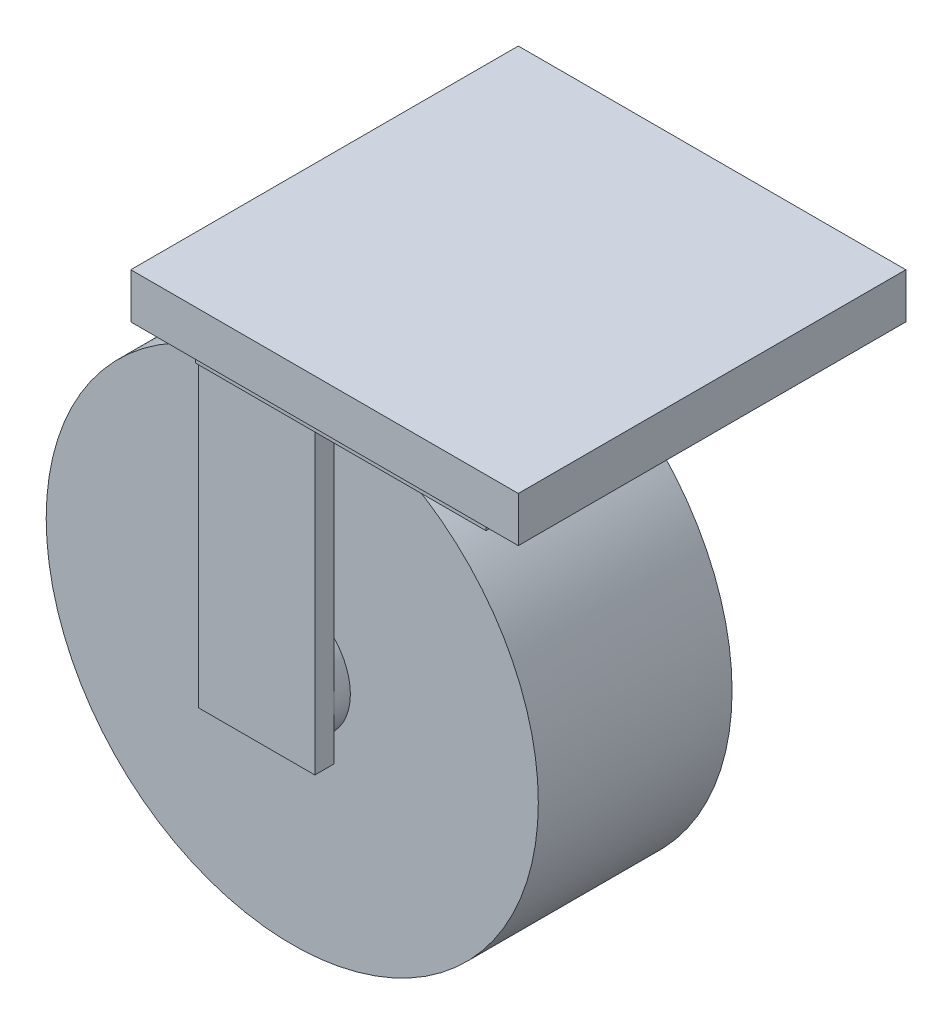
ISO-10303-21;
HEADER;
FILE_DESCRIPTION(('STEP AP214'),'2;1');
FILE_NAME('part.step','',(''),(''),'','','');
FILE_SCHEMA(('AUTOMOTIVE_DESIGN { 1 0 10303 214 1 1 1 1 }'));
ENDSEC;
DATA;
#1=APPLICATION_CONTEXT('core data for automotive mechanical design processes');
#2=APPLICATION_PROTOCOL_DEFINITION('international standard','automotive_design',2000,#1);
#3=PRODUCT_CONTEXT('',#1,'mechanical');
#4=PRODUCT('Part','Part','',(#3));
#5=PRODUCT_RELATED_PRODUCT_CATEGORY('part','',(#4));
#6=PRODUCT_DEFINITION_FORMATION('','',#4);
#7=PRODUCT_DEFINITION_CONTEXT('part definition',#1,'design');
#8=PRODUCT_DEFINITION('design','',#6,#7);
#9=PRODUCT_DEFINITION_SHAPE('','',#8);
#10=(LENGTH_UNIT() NAMED_UNIT(*) SI_UNIT(.MILLI.,.METRE.));
#11=(NAMED_UNIT(*) PLANE_ANGLE_UNIT() SI_UNIT($,.RADIAN.));
#12=(NAMED_UNIT(*) SI_UNIT($,.STERADIAN.) SOLID_ANGLE_UNIT());
#13=UNCERTAINTY_MEASURE_WITH_UNIT(LENGTH_MEASURE(1.E-05),#10,'distance_accuracy_value','');
#14=(GEOMETRIC_REPRESENTATION_CONTEXT(3) GLOBAL_UNCERTAINTY_ASSIGNED_CONTEXT((#13)) GLOBAL_UNIT_ASSIGNED_CONTEXT((#10,
#11,#12)) REPRESENTATION_CONTEXT('',''));
#15=CARTESIAN_POINT('',(0.,0.,0.));
#16=DIRECTION('',(0.,0.,1.));
#17=DIRECTION('',(1.,0.,0.));
#18=AXIS2_PLACEMENT_3D('',#15,#16,#17);
#19=CARTESIAN_POINT('',(-5.95,38.1,17.5));
#20=DIRECTION('',(0.,0.,-1.));
#21=DIRECTION('',(-1.,0.,0.));
#22=AXIS2_PLACEMENT_3D('',#19,#20,#21);
#23=CYLINDRICAL_SURFACE('',#22,9.);
#24=CARTESIAN_POINT('',(-5.95,38.1,-17.5));
#25=DIRECTION('',(0.,0.,1.));
#26=DIRECTION('',(1.,0.,0.));
#27=AXIS2_PLACEMENT_3D('',#24,#25,#26);
#28=CIRCLE('',#27,9.);
#29=CARTESIAN_POINT('',(3.05,38.1,-17.5));
#30=VERTEX_POINT('',#29);
#31=CARTESIAN_POINT('',(-14.95,38.1,-17.5));
#32=VERTEX_POINT('',#31);
#33=EDGE_CURVE('E384',#30,#32,#28,.T.);
#34=ORIENTED_EDGE('',*,*,#33,.T.);
#35=CARTESIAN_POINT('',(-9.8730090491866,30.,-17.5));
#36=VERTEX_POINT('',#35);
#37=EDGE_CURVE('E56',#32,#36,#28,.T.);
#38=ORIENTED_EDGE('',*,*,#37,.T.);
#39=CARTESIAN_POINT('',(-2.0269909508134,30.,-17.5));
#40=VERTEX_POINT('',#39);
#41=EDGE_CURVE('E400',#36,#40,#28,.T.);
#42=ORIENTED_EDGE('',*,*,#41,.T.);
#43=EDGE_CURVE('E69',#40,#30,#28,.T.);
#44=ORIENTED_EDGE('',*,*,#43,.T.);
#45=EDGE_LOOP('',(#34,#38,#42,#44));
#46=FACE_BOUND('',#45,.T.);
#47=CARTESIAN_POINT('',(-5.95,38.1,-15.));
#48=DIRECTION('',(0.,0.,1.));
#49=DIRECTION('',(1.,0.,0.));
#50=AXIS2_PLACEMENT_3D('',#47,#48,#49);
#51=CIRCLE('',#50,9.);
#52=CARTESIAN_POINT('',(3.05,38.1,-15.));
#53=VERTEX_POINT('',#52);
#54=EDGE_CURVE('E11',#53,#53,#51,.T.);
#55=ORIENTED_EDGE('',*,*,#54,.F.);
#56=EDGE_LOOP('',(#55));
#57=FACE_BOUND('',#56,.T.);
#58=ADVANCED_FACE('F43',(#46,#57),#23,.T.);
#59=CARTESIAN_POINT('',(-14.95,78.,-17.5));
#60=DIRECTION('',(0.,0.,-1.));
#61=DIRECTION('',(-1.,0.,0.));
#62=AXIS2_PLACEMENT_3D('',#59,#60,#61);
#63=PLANE('',#62);
#64=ORIENTED_EDGE('',*,*,#37,.F.);
#65=DIRECTION('',(0.,-1.,0.));
#66=VECTOR('',#65,1.);
#67=CARTESIAN_POINT('',(-14.95,78.,-17.5));
#68=LINE('',#67,#66);
#69=CARTESIAN_POINT('',(-14.95,30.,-17.5));
#70=VERTEX_POINT('',#69);
#71=EDGE_CURVE('E271',#32,#70,#68,.T.);
#72=ORIENTED_EDGE('',*,*,#71,.T.);
#73=DIRECTION('',(1.,0.,0.));
#74=VECTOR('',#73,1.);
#75=CARTESIAN_POINT('',(-14.95,30.,-17.5));
#76=LINE('',#75,#74);
#77=EDGE_CURVE('E254',#70,#36,#76,.T.);
#78=ORIENTED_EDGE('',*,*,#77,.T.);
#79=EDGE_LOOP('',(#64,#72,#78));
#80=FACE_BOUND('',#79,.T.);
#81=ADVANCED_FACE('F410',(#80),#63,.F.);
#82=ORIENTED_EDGE('',*,*,#33,.F.);
#83=DIRECTION('',(0.,-1.,0.));
#84=VECTOR('',#83,1.);
#85=CARTESIAN_POINT('',(3.05,78.,-17.5));
#86=LINE('',#85,#84);
#87=CARTESIAN_POINT('',(3.05,76.5,-17.5));
#88=VERTEX_POINT('',#87);
#89=EDGE_CURVE('E267',#88,#30,#86,.T.);
#90=ORIENTED_EDGE('',*,*,#89,.F.);
#91=DIRECTION('',(-1.,0.,0.));
#92=VECTOR('',#91,1.);
#93=CARTESIAN_POINT('',(0.,76.5,-17.5));
#94=LINE('',#93,#92);
#95=CARTESIAN_POINT('',(-14.95,76.5,-17.5));
#96=VERTEX_POINT('',#95);
#97=EDGE_CURVE('E360',#88,#96,#94,.T.);
#98=ORIENTED_EDGE('',*,*,#97,.T.);
#99=EDGE_CURVE('E275',#96,#32,#68,.T.);
#100=ORIENTED_EDGE('',*,*,#99,.T.);
#101=EDGE_LOOP('',(#82,#90,#98,#100));
#102=FACE_BOUND('',#101,.T.);
#103=ADVANCED_FACE('F408',(#102),#63,.F.);
#104=CARTESIAN_POINT('',(3.05,78.,17.5));
#105=DIRECTION('',(0.,0.,1.));
#106=DIRECTION('',(1.,0.,0.));
#107=AXIS2_PLACEMENT_3D('',#104,#105,#106);
#108=PLANE('',#107);
#109=DIRECTION('',(0.,-1.,0.));
#110=VECTOR('',#109,1.);
#111=CARTESIAN_POINT('',(-14.95,78.,17.5));
#112=LINE('',#111,#110);
#113=CARTESIAN_POINT('',(-14.95,38.1,17.5));
#114=VERTEX_POINT('',#113);
#115=CARTESIAN_POINT('',(-14.95,30.,17.5));
#116=VERTEX_POINT('',#115);
#117=EDGE_CURVE('E223',#114,#116,#112,.T.);
#118=ORIENTED_EDGE('',*,*,#117,.F.);
#119=CARTESIAN_POINT('',(-5.95,38.1,17.5));
#120=DIRECTION('',(0.,0.,1.));
#121=DIRECTION('',(1.,0.,0.));
#122=AXIS2_PLACEMENT_3D('',#119,#120,#121);
#123=CIRCLE('',#122,9.);
#124=CARTESIAN_POINT('',(-9.8730090491866,30.,17.5));
#125=VERTEX_POINT('',#124);
#126=EDGE_CURVE('E205',#114,#125,#123,.T.);
#127=ORIENTED_EDGE('',*,*,#126,.T.);
#128=DIRECTION('',(-1.,0.,0.));
#129=VECTOR('',#128,1.);
#130=CARTESIAN_POINT('',(3.05,30.,17.5));
#131=LINE('',#130,#129);
#132=EDGE_CURVE('E229',#125,#116,#131,.T.);
#133=ORIENTED_EDGE('',*,*,#132,.T.);
#134=EDGE_LOOP('',(#118,#127,#133));
#135=FACE_BOUND('',#134,.T.);
#136=ADVANCED_FACE('F228',(#135),#108,.F.);
#137=DIRECTION('',(0.,-1.,0.));
#138=VECTOR('',#137,1.);
#139=CARTESIAN_POINT('',(3.05,78.,17.5));
#140=LINE('',#139,#138);
#141=CARTESIAN_POINT('',(3.05,76.5,17.5));
#142=VERTEX_POINT('',#141);
#143=CARTESIAN_POINT('',(3.05,38.1,17.5));
#144=VERTEX_POINT('',#143);
#145=EDGE_CURVE('E225',#142,#144,#140,.T.);
#146=ORIENTED_EDGE('',*,*,#145,.T.);
#147=EDGE_CURVE('E202',#144,#114,#123,.T.);
#148=ORIENTED_EDGE('',*,*,#147,.T.);
#149=CARTESIAN_POINT('',(-14.95,76.5,17.5));
#150=VERTEX_POINT('',#149);
#151=EDGE_CURVE('E219',#150,#114,#112,.T.);
#152=ORIENTED_EDGE('',*,*,#151,.F.);
#153=DIRECTION('',(1.,0.,0.));
#154=VECTOR('',#153,1.);
#155=CARTESIAN_POINT('',(0.,76.5,17.5));
#156=LINE('',#155,#154);
#157=EDGE_CURVE('E247',#150,#142,#156,.T.);
#158=ORIENTED_EDGE('',*,*,#157,.T.);
#159=EDGE_LOOP('',(#146,#148,#152,#158));
#160=FACE_BOUND('',#159,.T.);
#161=ADVANCED_FACE('F220',(#160),#108,.F.);
#162=CARTESIAN_POINT('',(3.05,30.,17.5));
#163=VERTEX_POINT('',#162);
#164=CARTESIAN_POINT('',(-2.0269909508134,30.,17.5));
#165=VERTEX_POINT('',#164);
#166=EDGE_CURVE('E232',#163,#165,#131,.T.);
#167=ORIENTED_EDGE('',*,*,#166,.T.);
#168=EDGE_CURVE('E221',#165,#144,#123,.T.);
#169=ORIENTED_EDGE('',*,*,#168,.T.);
#170=EDGE_CURVE('E240',#144,#163,#140,.T.);
#171=ORIENTED_EDGE('',*,*,#170,.T.);
#172=EDGE_LOOP('',(#167,#169,#171));
#173=FACE_BOUND('',#172,.T.);
#174=ADVANCED_FACE('F449',(#173),#108,.F.);
#175=CARTESIAN_POINT('',(0.,76.5,0.));
#176=DIRECTION('',(0.,1.,0.));
#177=DIRECTION('',(0.,0.,1.));
#178=AXIS2_PLACEMENT_3D('',#175,#176,#177);
#179=PLANE('',#178);
#180=DIRECTION('',(-1.,0.,0.));
#181=VECTOR('',#180,1.);
#182=CARTESIAN_POINT('',(0.,76.5,20.5));
#183=LINE('',#182,#181);
#184=CARTESIAN_POINT('',(3.05,76.5,20.5));
#185=VERTEX_POINT('',#184);
#186=CARTESIAN_POINT('',(-14.95,76.5,20.5));
#187=VERTEX_POINT('',#186);
#188=EDGE_CURVE('E250',#185,#187,#183,.T.);
#189=ORIENTED_EDGE('',*,*,#188,.F.);
#190=DIRECTION('',(0.,0.,1.));
#191=VECTOR('',#190,1.);
#192=CARTESIAN_POINT('',(3.05,76.5,0.));
#193=LINE('',#192,#191);
#194=EDGE_CURVE('E55',#142,#185,#193,.T.);
#195=ORIENTED_EDGE('',*,*,#194,.F.);
#196=ORIENTED_EDGE('',*,*,#157,.F.);
#197=DIRECTION('',(0.,0.,1.));
#198=VECTOR('',#197,1.);
#199=CARTESIAN_POINT('',(-14.95,76.5,-21.));
#200=LINE('',#199,#198);
#201=EDGE_CURVE('E237',#96,#150,#200,.T.);
#202=ORIENTED_EDGE('',*,*,#201,.F.);
#203=ORIENTED_EDGE('',*,*,#97,.F.);
#204=DIRECTION('',(0.,0.,1.));
#205=VECTOR('',#204,1.);
#206=CARTESIAN_POINT('',(3.05,76.5,0.));
#207=LINE('',#206,#205);
#208=CARTESIAN_POINT('',(3.05,76.5,-20.5));
#209=VERTEX_POINT('',#208);
#210=EDGE_CURVE('E351',#209,#88,#207,.T.);
#211=ORIENTED_EDGE('',*,*,#210,.F.);
#212=DIRECTION('',(1.,0.,0.));
#213=VECTOR('',#212,1.);
#214=CARTESIAN_POINT('',(0.,76.5,-20.5));
#215=LINE('',#214,#213);
#216=CARTESIAN_POINT('',(-14.95,76.5,-20.5));
#217=VERTEX_POINT('',#216);
#218=EDGE_CURVE('E354',#217,#209,#215,.T.);
#219=ORIENTED_EDGE('',*,*,#218,.F.);
#220=CARTESIAN_POINT('',(-14.95,76.5,-21.));
#221=VERTEX_POINT('',#220);
#222=EDGE_CURVE('E298',#221,#217,#200,.T.);
#223=ORIENTED_EDGE('',*,*,#222,.F.);
#224=DIRECTION('',(-1.,0.,0.));
#225=VECTOR('',#224,1.);
#226=CARTESIAN_POINT('',(30.05,76.5,-21.));
#227=LINE('',#226,#225);
#228=CARTESIAN_POINT('',(30.05,76.5,-21.));
#229=VERTEX_POINT('',#228);
#230=EDGE_CURVE('E278',#229,#221,#227,.T.);
#231=ORIENTED_EDGE('',*,*,#230,.F.);
#232=DIRECTION('',(0.,0.,-1.));
#233=VECTOR('',#232,1.);
#234=CARTESIAN_POINT('',(30.05,76.5,21.));
#235=LINE('',#234,#233);
#236=CARTESIAN_POINT('',(30.05,76.5,21.));
#237=VERTEX_POINT('',#236);
#238=EDGE_CURVE('E302',#237,#229,#235,.T.);
#239=ORIENTED_EDGE('',*,*,#238,.F.);
#240=DIRECTION('',(1.,0.,0.));
#241=VECTOR('',#240,1.);
#242=CARTESIAN_POINT('',(-14.95,76.5,21.));
#243=LINE('',#242,#241);
#244=CARTESIAN_POINT('',(-14.95,76.5,21.));
#245=VERTEX_POINT('',#244);
#246=EDGE_CURVE('E300',#245,#237,#243,.T.);
#247=ORIENTED_EDGE('',*,*,#246,.F.);
#248=EDGE_CURVE('E274',#187,#245,#200,.T.);
#249=ORIENTED_EDGE('',*,*,#248,.F.);
#250=EDGE_LOOP('',(#189,#195,#196,#202,#203,#211,#219,#223,#231,#239,#247,#249));
#251=FACE_BOUND('',#250,.T.);
#252=ADVANCED_FACE('F419',(#251),#179,.F.);
#253=CARTESIAN_POINT('',(14.05,80.,0.));
#254=DIRECTION('',(0.,1.,0.));
#255=DIRECTION('',(0.,0.,1.));
#256=AXIS2_PLACEMENT_3D('',#253,#254,#255);
#257=PLANE('',#256);
#258=CARTESIAN_POINT('',(14.05,80.,0.));
#259=DIRECTION('',(0.,1.,0.));
#260=DIRECTION('',(0.,0.,1.));
#261=AXIS2_PLACEMENT_3D('',#258,#259,#260);
#262=CIRCLE('',#261,22.);
#263=CARTESIAN_POINT('',(7.49256147569799,80.,21.));
#264=VERTEX_POINT('',#263);
#265=CARTESIAN_POINT('',(20.607438524302,80.,21.));
#266=VERTEX_POINT('',#265);
#267=EDGE_CURVE('E312',#264,#266,#262,.T.);
#268=ORIENTED_EDGE('',*,*,#267,.F.);
#269=DIRECTION('',(1.,0.,0.));
#270=VECTOR('',#269,1.);
#271=CARTESIAN_POINT('',(-14.95,80.,21.));
#272=LINE('',#271,#270);
#273=EDGE_CURVE('E281',#264,#266,#272,.T.);
#274=ORIENTED_EDGE('',*,*,#273,.T.);
#275=EDGE_LOOP('',(#268,#274));
#276=FACE_BOUND('',#275,.T.);
#277=ADVANCED_FACE('F495',(#276),#257,.F.);
#278=CARTESIAN_POINT('',(30.05,80.,15.0996688705415));
#279=VERTEX_POINT('',#278);
#280=CARTESIAN_POINT('',(30.05,80.,-15.0996688705415));
#281=VERTEX_POINT('',#280);
#282=EDGE_CURVE('E323',#279,#281,#262,.T.);
#283=ORIENTED_EDGE('',*,*,#282,.F.);
#284=DIRECTION('',(0.,0.,-1.));
#285=VECTOR('',#284,1.);
#286=CARTESIAN_POINT('',(30.05,80.,21.));
#287=LINE('',#286,#285);
#288=EDGE_CURVE('E288',#279,#281,#287,.T.);
#289=ORIENTED_EDGE('',*,*,#288,.T.);
#290=EDGE_LOOP('',(#283,#289));
#291=FACE_BOUND('',#290,.T.);
#292=ADVANCED_FACE('F501',(#291),#257,.F.);
#293=CARTESIAN_POINT('',(-15.95,93.,-30.));
#294=DIRECTION('',(1.,0.,0.));
#295=DIRECTION('',(0.,0.,-1.));
#296=AXIS2_PLACEMENT_3D('',#293,#294,#295);
#297=PLANE('',#296);
#298=DIRECTION('',(0.,-1.,0.));
#299=VECTOR('',#298,1.);
#300=CARTESIAN_POINT('',(-15.95,93.,-30.));
#301=LINE('',#300,#299);
#302=CARTESIAN_POINT('',(-15.95,93.,-30.));
#303=VERTEX_POINT('',#302);
#304=CARTESIAN_POINT('',(-15.95,86.,-30.));
#305=VERTEX_POINT('',#304);
#306=EDGE_CURVE('E341',#303,#305,#301,.T.);
#307=ORIENTED_EDGE('',*,*,#306,.T.);
#308=DIRECTION('',(0.,0.,1.));
#309=VECTOR('',#308,1.);
#310=CARTESIAN_POINT('',(-15.95,86.,-30.));
#311=LINE('',#310,#309);
#312=CARTESIAN_POINT('',(-15.95,86.,30.));
#313=VERTEX_POINT('',#312);
#314=EDGE_CURVE('E317',#305,#313,#311,.T.);
#315=ORIENTED_EDGE('',*,*,#314,.T.);
#316=DIRECTION('',(0.,-1.,0.));
#317=VECTOR('',#316,1.);
#318=CARTESIAN_POINT('',(-15.95,93.,30.));
#319=LINE('',#318,#317);
#320=CARTESIAN_POINT('',(-15.95,93.,30.));
#321=VERTEX_POINT('',#320);
#322=EDGE_CURVE('E348',#321,#313,#319,.T.);
#323=ORIENTED_EDGE('',*,*,#322,.F.);
#324=DIRECTION('',(0.,0.,1.));
#325=VECTOR('',#324,1.);
#326=CARTESIAN_POINT('',(-15.95,93.,-30.));
#327=LINE('',#326,#325);
#328=EDGE_CURVE('E333',#303,#321,#327,.T.);
#329=ORIENTED_EDGE('',*,*,#328,.F.);
#330=EDGE_LOOP('',(#307,#315,#323,#329));
#331=FACE_BOUND('',#330,.T.);
#332=ADVANCED_FACE('F44',(#331),#297,.F.);
#333=CARTESIAN_POINT('',(-15.95,93.,30.));
#334=DIRECTION('',(0.,0.,-1.));
#335=DIRECTION('',(-1.,0.,0.));
#336=AXIS2_PLACEMENT_3D('',#333,#334,#335);
#337=PLANE('',#336);
#338=ORIENTED_EDGE('',*,*,#322,.T.);
#339=DIRECTION('',(1.,0.,0.));
#340=VECTOR('',#339,1.);
#341=CARTESIAN_POINT('',(-15.95,86.,30.));
#342=LINE('',#341,#340);
#343=CARTESIAN_POINT('',(44.05,86.,30.));
#344=VERTEX_POINT('',#343);
#345=EDGE_CURVE('E326',#313,#344,#342,.T.);
#346=ORIENTED_EDGE('',*,*,#345,.T.);
#347=DIRECTION('',(0.,-1.,0.));
#348=VECTOR('',#347,1.);
#349=CARTESIAN_POINT('',(44.05,93.,30.));
#350=LINE('',#349,#348);
#351=CARTESIAN_POINT('',(44.05,93.,30.));
#352=VERTEX_POINT('',#351);
#353=EDGE_CURVE('E346',#352,#344,#350,.T.);
#354=ORIENTED_EDGE('',*,*,#353,.F.);
#355=DIRECTION('',(1.,0.,0.));
#356=VECTOR('',#355,1.);
#357=CARTESIAN_POINT('',(-15.95,93.,30.));
#358=LINE('',#357,#356);
#359=EDGE_CURVE('E337',#321,#352,#358,.T.);
#360=ORIENTED_EDGE('',*,*,#359,.F.);
#361=EDGE_LOOP('',(#338,#346,#354,#360));
#362=FACE_BOUND('',#361,.T.);
#363=ADVANCED_FACE('F525',(#362),#337,.F.);
#364=CARTESIAN_POINT('',(44.05,93.,30.));
#365=DIRECTION('',(-1.,0.,0.));
#366=DIRECTION('',(0.,0.,1.));
#367=AXIS2_PLACEMENT_3D('',#364,#365,#366);
#368=PLANE('',#367);
#369=ORIENTED_EDGE('',*,*,#353,.T.);
#370=DIRECTION('',(0.,0.,-1.));
#371=VECTOR('',#370,1.);
#372=CARTESIAN_POINT('',(44.05,86.,30.));
#373=LINE('',#372,#371);
#374=CARTESIAN_POINT('',(44.05,86.,-30.));
#375=VERTEX_POINT('',#374);
#376=EDGE_CURVE('E328',#344,#375,#373,.T.);
#377=ORIENTED_EDGE('',*,*,#376,.T.);
#378=DIRECTION('',(0.,-1.,0.));
#379=VECTOR('',#378,1.);
#380=CARTESIAN_POINT('',(44.05,93.,-30.));
#381=LINE('',#380,#379);
#382=CARTESIAN_POINT('',(44.05,93.,-30.));
#383=VERTEX_POINT('',#382);
#384=EDGE_CURVE('E347',#383,#375,#381,.T.);
#385=ORIENTED_EDGE('',*,*,#384,.F.);
#386=DIRECTION('',(0.,0.,-1.));
#387=VECTOR('',#386,1.);
#388=CARTESIAN_POINT('',(44.05,93.,30.));
#389=LINE('',#388,#387);
#390=EDGE_CURVE('E336',#352,#383,#389,.T.);
#391=ORIENTED_EDGE('',*,*,#390,.F.);
#392=EDGE_LOOP('',(#369,#377,#385,#391));
#393=FACE_BOUND('',#392,.T.);
#394=ADVANCED_FACE('F516',(#393),#368,.F.);
#395=CARTESIAN_POINT('',(44.05,93.,-30.));
#396=DIRECTION('',(0.,0.,1.));
#397=DIRECTION('',(1.,0.,0.));
#398=AXIS2_PLACEMENT_3D('',#395,#396,#397);
#399=PLANE('',#398);
#400=ORIENTED_EDGE('',*,*,#384,.T.);
#401=DIRECTION('',(-1.,0.,0.));
#402=VECTOR('',#401,1.);
#403=CARTESIAN_POINT('',(44.05,86.,-30.));
#404=LINE('',#403,#402);
#405=EDGE_CURVE('E335',#375,#305,#404,.T.);
#406=ORIENTED_EDGE('',*,*,#405,.T.);
#407=ORIENTED_EDGE('',*,*,#306,.F.);
#408=DIRECTION('',(-1.,0.,0.));
#409=VECTOR('',#408,1.);
#410=CARTESIAN_POINT('',(44.05,93.,-30.));
#411=LINE('',#410,#409);
#412=EDGE_CURVE('E344',#383,#303,#411,.T.);
#413=ORIENTED_EDGE('',*,*,#412,.F.);
#414=EDGE_LOOP('',(#400,#406,#407,#413));
#415=FACE_BOUND('',#414,.T.);
#416=ADVANCED_FACE('F518',(#415),#399,.F.);
#417=CARTESIAN_POINT('',(0.,93.,0.));
#418=DIRECTION('',(0.,1.,0.));
#419=DIRECTION('',(0.,0.,1.));
#420=AXIS2_PLACEMENT_3D('',#417,#418,#419);
#421=PLANE('',#420);
#422=ORIENTED_EDGE('',*,*,#328,.T.);
#423=ORIENTED_EDGE('',*,*,#359,.T.);
#424=ORIENTED_EDGE('',*,*,#390,.T.);
#425=ORIENTED_EDGE('',*,*,#412,.T.);
#426=EDGE_LOOP('',(#422,#423,#424,#425));
#427=FACE_BOUND('',#426,.T.);
#428=ADVANCED_FACE('F515',(#427),#421,.T.);
#429=CARTESIAN_POINT('',(0.,86.,0.));
#430=DIRECTION('',(0.,1.,0.));
#431=DIRECTION('',(0.,0.,1.));
#432=AXIS2_PLACEMENT_3D('',#429,#430,#431);
#433=PLANE('',#432);
#434=CARTESIAN_POINT('',(14.05,86.,0.));
#435=DIRECTION('',(0.,1.,0.));
#436=DIRECTION('',(0.,0.,1.));
#437=AXIS2_PLACEMENT_3D('',#434,#435,#436);
#438=CIRCLE('',#437,22.);
#439=CARTESIAN_POINT('',(14.05,86.,22.));
#440=VERTEX_POINT('',#439);
#441=EDGE_CURVE('E316',#440,#440,#438,.T.);
#442=ORIENTED_EDGE('',*,*,#441,.T.);
#443=EDGE_LOOP('',(#442));
#444=FACE_BOUND('',#443,.T.);
#445=ORIENTED_EDGE('',*,*,#314,.F.);
#446=ORIENTED_EDGE('',*,*,#405,.F.);
#447=ORIENTED_EDGE('',*,*,#376,.F.);
#448=ORIENTED_EDGE('',*,*,#345,.F.);
#449=EDGE_LOOP('',(#445,#446,#447,#448));
#450=FACE_BOUND('',#449,.T.);
#451=ADVANCED_FACE('F510',(#444,#450),#433,.F.);
#452=CARTESIAN_POINT('',(14.05,86.,0.));
#453=DIRECTION('',(0.,-1.,0.));
#454=DIRECTION('',(0.,0.,-1.));
#455=AXIS2_PLACEMENT_3D('',#452,#453,#454);
#456=CYLINDRICAL_SURFACE('',#455,22.);
#457=ORIENTED_EDGE('',*,*,#441,.F.);
#458=EDGE_LOOP('',(#457));
#459=FACE_BOUND('',#458,.T.);
#460=EDGE_CURVE('E319',#266,#279,#262,.T.);
#461=ORIENTED_EDGE('',*,*,#460,.T.);
#462=ORIENTED_EDGE('',*,*,#282,.T.);
#463=CARTESIAN_POINT('',(20.607438524302,80.,-21.));
#464=VERTEX_POINT('',#463);
#465=EDGE_CURVE('E553',#281,#464,#262,.T.);
#466=ORIENTED_EDGE('',*,*,#465,.T.);
#467=CARTESIAN_POINT('',(7.492561475698,80.,-21.));
#468=VERTEX_POINT('',#467);
#469=EDGE_CURVE('E565',#464,#468,#262,.T.);
#470=ORIENTED_EDGE('',*,*,#469,.T.);
#471=EDGE_CURVE('E561',#468,#264,#262,.T.);
#472=ORIENTED_EDGE('',*,*,#471,.T.);
#473=ORIENTED_EDGE('',*,*,#267,.T.);
#474=EDGE_LOOP('',(#461,#462,#466,#470,#472,#473));
#475=FACE_BOUND('',#474,.T.);
#476=ADVANCED_FACE('F502',(#459,#475),#456,.T.);
#477=ORIENTED_EDGE('',*,*,#469,.F.);
#478=DIRECTION('',(-1.,0.,0.));
#479=VECTOR('',#478,1.);
#480=CARTESIAN_POINT('',(30.05,80.,-21.));
#481=LINE('',#480,#479);
#482=EDGE_CURVE('E293',#464,#468,#481,.T.);
#483=ORIENTED_EDGE('',*,*,#482,.T.);
#484=EDGE_LOOP('',(#477,#483));
#485=FACE_BOUND('',#484,.T.);
#486=ADVANCED_FACE('F490',(#485),#257,.F.);
#487=CARTESIAN_POINT('',(0.,80.,0.));
#488=DIRECTION('',(0.,1.,0.));
#489=DIRECTION('',(0.,0.,1.));
#490=AXIS2_PLACEMENT_3D('',#487,#488,#489);
#491=PLANE('',#490);
#492=ORIENTED_EDGE('',*,*,#460,.F.);
#493=CARTESIAN_POINT('',(30.05,80.,21.));
#494=VERTEX_POINT('',#493);
#495=EDGE_CURVE('E276',#266,#494,#272,.T.);
#496=ORIENTED_EDGE('',*,*,#495,.T.);
#497=EDGE_CURVE('E287',#494,#279,#287,.T.);
#498=ORIENTED_EDGE('',*,*,#497,.T.);
#499=EDGE_LOOP('',(#492,#496,#498));
#500=FACE_BOUND('',#499,.T.);
#501=ADVANCED_FACE('F483',(#500),#491,.T.);
#502=ORIENTED_EDGE('',*,*,#465,.F.);
#503=CARTESIAN_POINT('',(30.05,80.,-21.));
#504=VERTEX_POINT('',#503);
#505=EDGE_CURVE('E285',#281,#504,#287,.T.);
#506=ORIENTED_EDGE('',*,*,#505,.T.);
#507=EDGE_CURVE('E292',#504,#464,#481,.T.);
#508=ORIENTED_EDGE('',*,*,#507,.T.);
#509=EDGE_LOOP('',(#502,#506,#508));
#510=FACE_BOUND('',#509,.T.);
#511=ADVANCED_FACE('F486',(#510),#491,.T.);
#512=ORIENTED_EDGE('',*,*,#471,.F.);
#513=CARTESIAN_POINT('',(-14.95,80.,-21.));
#514=VERTEX_POINT('',#513);
#515=EDGE_CURVE('E286',#468,#514,#481,.T.);
#516=ORIENTED_EDGE('',*,*,#515,.T.);
#517=DIRECTION('',(0.,0.,1.));
#518=VECTOR('',#517,1.);
#519=CARTESIAN_POINT('',(-14.95,80.,-21.));
#520=LINE('',#519,#518);
#521=CARTESIAN_POINT('',(-14.95,80.,21.));
#522=VERTEX_POINT('',#521);
#523=EDGE_CURVE('E277',#514,#522,#520,.T.);
#524=ORIENTED_EDGE('',*,*,#523,.T.);
#525=EDGE_CURVE('E283',#522,#264,#272,.T.);
#526=ORIENTED_EDGE('',*,*,#525,.T.);
#527=EDGE_LOOP('',(#512,#516,#524,#526));
#528=FACE_BOUND('',#527,.T.);
#529=ADVANCED_FACE('F487',(#528),#491,.T.);
#530=CARTESIAN_POINT('',(-14.95,80.,-21.));
#531=DIRECTION('',(1.,0.,0.));
#532=DIRECTION('',(0.,0.,-1.));
#533=AXIS2_PLACEMENT_3D('',#530,#531,#532);
#534=PLANE('',#533);
#535=ORIENTED_EDGE('',*,*,#201,.T.);
#536=ORIENTED_EDGE('',*,*,#151,.T.);
#537=ORIENTED_EDGE('',*,*,#117,.T.);
#538=DIRECTION('',(0.,0.,1.));
#539=VECTOR('',#538,1.);
#540=CARTESIAN_POINT('',(-14.95,30.,17.5));
#541=LINE('',#540,#539);
#542=CARTESIAN_POINT('',(-14.95,30.,20.5));
#543=VERTEX_POINT('',#542);
#544=EDGE_CURVE('E224',#116,#543,#541,.T.);
#545=ORIENTED_EDGE('',*,*,#544,.T.);
#546=DIRECTION('',(0.,-1.,0.));
#547=VECTOR('',#546,1.);
#548=CARTESIAN_POINT('',(-14.95,78.,20.5));
#549=LINE('',#548,#547);
#550=EDGE_CURVE('E245',#187,#543,#549,.T.);
#551=ORIENTED_EDGE('',*,*,#550,.F.);
#552=ORIENTED_EDGE('',*,*,#248,.T.);
#553=DIRECTION('',(0.,-1.,0.));
#554=VECTOR('',#553,1.);
#555=CARTESIAN_POINT('',(-14.95,80.,21.));
#556=LINE('',#555,#554);
#557=EDGE_CURVE('E315',#522,#245,#556,.T.);
#558=ORIENTED_EDGE('',*,*,#557,.F.);
#559=ORIENTED_EDGE('',*,*,#523,.F.);
#560=DIRECTION('',(0.,-1.,0.));
#561=VECTOR('',#560,1.);
#562=CARTESIAN_POINT('',(-14.95,80.,-21.));
#563=LINE('',#562,#561);
#564=EDGE_CURVE('E294',#514,#221,#563,.T.);
#565=ORIENTED_EDGE('',*,*,#564,.T.);
#566=ORIENTED_EDGE('',*,*,#222,.T.);
#567=DIRECTION('',(0.,-1.,0.));
#568=VECTOR('',#567,1.);
#569=CARTESIAN_POINT('',(-14.95,78.,-20.5));
#570=LINE('',#569,#568);
#571=CARTESIAN_POINT('',(-14.95,30.,-20.5));
#572=VERTEX_POINT('',#571);
#573=EDGE_CURVE('E262',#217,#572,#570,.T.);
#574=ORIENTED_EDGE('',*,*,#573,.T.);
#575=DIRECTION('',(0.,0.,1.));
#576=VECTOR('',#575,1.);
#577=CARTESIAN_POINT('',(-14.95,30.,-20.5));
#578=LINE('',#577,#576);
#579=EDGE_CURVE('E253',#572,#70,#578,.T.);
#580=ORIENTED_EDGE('',*,*,#579,.T.);
#581=ORIENTED_EDGE('',*,*,#71,.F.);
#582=ORIENTED_EDGE('',*,*,#99,.F.);
#583=EDGE_LOOP('',(#535,#536,#537,#545,#551,#552,#558,#559,#565,#566,#574,#580,#581,#582));
#584=FACE_BOUND('',#583,.T.);
#585=ADVANCED_FACE('F231',(#584),#534,.F.);
#586=CARTESIAN_POINT('',(-14.95,80.,21.));
#587=DIRECTION('',(0.,0.,-1.));
#588=DIRECTION('',(-1.,0.,0.));
#589=AXIS2_PLACEMENT_3D('',#586,#587,#588);
#590=PLANE('',#589);
#591=ORIENTED_EDGE('',*,*,#246,.T.);
#592=DIRECTION('',(0.,-1.,0.));
#593=VECTOR('',#592,1.);
#594=CARTESIAN_POINT('',(30.05,80.,21.));
#595=LINE('',#594,#593);
#596=EDGE_CURVE('E310',#494,#237,#595,.T.);
#597=ORIENTED_EDGE('',*,*,#596,.F.);
#598=ORIENTED_EDGE('',*,*,#495,.F.);
#599=ORIENTED_EDGE('',*,*,#273,.F.);
#600=ORIENTED_EDGE('',*,*,#525,.F.);
#601=ORIENTED_EDGE('',*,*,#557,.T.);
#602=EDGE_LOOP('',(#591,#597,#598,#599,#600,#601));
#603=FACE_BOUND('',#602,.T.);
#604=ADVANCED_FACE('F445',(#603),#590,.F.);
#605=CARTESIAN_POINT('',(30.05,80.,21.));
#606=DIRECTION('',(-1.,0.,0.));
#607=DIRECTION('',(0.,0.,1.));
#608=AXIS2_PLACEMENT_3D('',#605,#606,#607);
#609=PLANE('',#608);
#610=ORIENTED_EDGE('',*,*,#238,.T.);
#611=DIRECTION('',(0.,-1.,0.));
#612=VECTOR('',#611,1.);
#613=CARTESIAN_POINT('',(30.05,80.,-21.));
#614=LINE('',#613,#612);
#615=EDGE_CURVE('E308',#504,#229,#614,.T.);
#616=ORIENTED_EDGE('',*,*,#615,.F.);
#617=ORIENTED_EDGE('',*,*,#505,.F.);
#618=ORIENTED_EDGE('',*,*,#288,.F.);
#619=ORIENTED_EDGE('',*,*,#497,.F.);
#620=ORIENTED_EDGE('',*,*,#596,.T.);
#621=EDGE_LOOP('',(#610,#616,#617,#618,#619,#620));
#622=FACE_BOUND('',#621,.T.);
#623=ADVANCED_FACE('F436',(#622),#609,.F.);
#624=CARTESIAN_POINT('',(30.05,80.,-21.));
#625=DIRECTION('',(0.,0.,1.));
#626=DIRECTION('',(1.,0.,0.));
#627=AXIS2_PLACEMENT_3D('',#624,#625,#626);
#628=PLANE('',#627);
#629=ORIENTED_EDGE('',*,*,#230,.T.);
#630=ORIENTED_EDGE('',*,*,#564,.F.);
#631=ORIENTED_EDGE('',*,*,#515,.F.);
#632=ORIENTED_EDGE('',*,*,#482,.F.);
#633=ORIENTED_EDGE('',*,*,#507,.F.);
#634=ORIENTED_EDGE('',*,*,#615,.T.);
#635=EDGE_LOOP('',(#629,#630,#631,#632,#633,#634));
#636=FACE_BOUND('',#635,.T.);
#637=ADVANCED_FACE('F431',(#636),#628,.F.);
#638=ORIENTED_EDGE('',*,*,#43,.F.);
#639=CARTESIAN_POINT('',(3.05,30.,-17.5));
#640=VERTEX_POINT('',#639);
#641=EDGE_CURVE('E255',#40,#640,#76,.T.);
#642=ORIENTED_EDGE('',*,*,#641,.T.);
#643=EDGE_CURVE('E268',#30,#640,#86,.T.);
#644=ORIENTED_EDGE('',*,*,#643,.F.);
#645=EDGE_LOOP('',(#638,#642,#644));
#646=FACE_BOUND('',#645,.T.);
#647=ADVANCED_FACE('F418',(#646),#63,.F.);
#648=CARTESIAN_POINT('',(3.05,78.,-17.5));
#649=DIRECTION('',(-1.,0.,0.));
#650=DIRECTION('',(0.,0.,1.));
#651=AXIS2_PLACEMENT_3D('',#648,#649,#650);
#652=PLANE('',#651);
#653=DIRECTION('',(0.,-1.,0.));
#654=VECTOR('',#653,1.);
#655=CARTESIAN_POINT('',(3.05,78.,-20.5));
#656=LINE('',#655,#654);
#657=CARTESIAN_POINT('',(3.05,30.,-20.5));
#658=VERTEX_POINT('',#657);
#659=EDGE_CURVE('E266',#209,#658,#656,.T.);
#660=ORIENTED_EDGE('',*,*,#659,.F.);
#661=ORIENTED_EDGE('',*,*,#210,.T.);
#662=ORIENTED_EDGE('',*,*,#89,.T.);
#663=ORIENTED_EDGE('',*,*,#643,.T.);
#664=DIRECTION('',(0.,0.,-1.));
#665=VECTOR('',#664,1.);
#666=CARTESIAN_POINT('',(3.05,30.,-17.5));
#667=LINE('',#666,#665);
#668=EDGE_CURVE('E260',#640,#658,#667,.T.);
#669=ORIENTED_EDGE('',*,*,#668,.T.);
#670=EDGE_LOOP('',(#660,#661,#662,#663,#669));
#671=FACE_BOUND('',#670,.T.);
#672=ADVANCED_FACE('F420',(#671),#652,.F.);
#673=CARTESIAN_POINT('',(3.05,78.,-20.5));
#674=DIRECTION('',(0.,0.,1.));
#675=DIRECTION('',(1.,0.,0.));
#676=AXIS2_PLACEMENT_3D('',#673,#674,#675);
#677=PLANE('',#676);
#678=ORIENTED_EDGE('',*,*,#573,.F.);
#679=ORIENTED_EDGE('',*,*,#218,.T.);
#680=ORIENTED_EDGE('',*,*,#659,.T.);
#681=DIRECTION('',(-1.,0.,0.));
#682=VECTOR('',#681,1.);
#683=CARTESIAN_POINT('',(3.05,30.,-20.5));
#684=LINE('',#683,#682);
#685=EDGE_CURVE('E261',#658,#572,#684,.T.);
#686=ORIENTED_EDGE('',*,*,#685,.T.);
#687=EDGE_LOOP('',(#678,#679,#680,#686));
#688=FACE_BOUND('',#687,.T.);
#689=ADVANCED_FACE('F424',(#688),#677,.F.);
#690=CARTESIAN_POINT('',(0.,30.,0.));
#691=DIRECTION('',(0.,1.,0.));
#692=DIRECTION('',(0.,0.,1.));
#693=AXIS2_PLACEMENT_3D('',#690,#691,#692);
#694=PLANE('',#693);
#695=ORIENTED_EDGE('',*,*,#579,.F.);
#696=ORIENTED_EDGE('',*,*,#685,.F.);
#697=ORIENTED_EDGE('',*,*,#668,.F.);
#698=ORIENTED_EDGE('',*,*,#641,.F.);
#699=EDGE_CURVE('E256',#36,#40,#76,.T.);
#700=ORIENTED_EDGE('',*,*,#699,.F.);
#701=ORIENTED_EDGE('',*,*,#77,.F.);
#702=EDGE_LOOP('',(#695,#696,#697,#698,#700,#701));
#703=FACE_BOUND('',#702,.T.);
#704=ADVANCED_FACE('F412',(#703),#694,.F.);
#705=CARTESIAN_POINT('',(3.05,78.,20.5));
#706=DIRECTION('',(-1.,0.,0.));
#707=DIRECTION('',(0.,0.,1.));
#708=AXIS2_PLACEMENT_3D('',#705,#706,#707);
#709=PLANE('',#708);
#710=ORIENTED_EDGE('',*,*,#145,.F.);
#711=ORIENTED_EDGE('',*,*,#194,.T.);
#712=DIRECTION('',(0.,-1.,0.));
#713=VECTOR('',#712,1.);
#714=CARTESIAN_POINT('',(3.05,78.,20.5));
#715=LINE('',#714,#713);
#716=CARTESIAN_POINT('',(3.05,30.,20.5));
#717=VERTEX_POINT('',#716);
#718=EDGE_CURVE('E244',#185,#717,#715,.T.);
#719=ORIENTED_EDGE('',*,*,#718,.T.);
#720=DIRECTION('',(0.,0.,-1.));
#721=VECTOR('',#720,1.);
#722=CARTESIAN_POINT('',(3.05,30.,20.5));
#723=LINE('',#722,#721);
#724=EDGE_CURVE('E376',#717,#163,#723,.T.);
#725=ORIENTED_EDGE('',*,*,#724,.T.);
#726=ORIENTED_EDGE('',*,*,#170,.F.);
#727=EDGE_LOOP('',(#710,#711,#719,#725,#726));
#728=FACE_BOUND('',#727,.T.);
#729=ADVANCED_FACE('F365',(#728),#709,.F.);
#730=CARTESIAN_POINT('',(-14.95,78.,20.5));
#731=DIRECTION('',(0.,0.,-1.));
#732=DIRECTION('',(-1.,0.,0.));
#733=AXIS2_PLACEMENT_3D('',#730,#731,#732);
#734=PLANE('',#733);
#735=ORIENTED_EDGE('',*,*,#718,.F.);
#736=ORIENTED_EDGE('',*,*,#188,.T.);
#737=ORIENTED_EDGE('',*,*,#550,.T.);
#738=DIRECTION('',(1.,0.,0.));
#739=VECTOR('',#738,1.);
#740=CARTESIAN_POINT('',(-14.95,30.,20.5));
#741=LINE('',#740,#739);
#742=EDGE_CURVE('E373',#543,#717,#741,.T.);
#743=ORIENTED_EDGE('',*,*,#742,.T.);
#744=EDGE_LOOP('',(#735,#736,#737,#743));
#745=FACE_BOUND('',#744,.T.);
#746=ADVANCED_FACE('F367',(#745),#734,.F.);
#747=CARTESIAN_POINT('',(0.,30.,0.));
#748=DIRECTION('',(0.,1.,0.));
#749=DIRECTION('',(0.,0.,1.));
#750=AXIS2_PLACEMENT_3D('',#747,#748,#749);
#751=PLANE('',#750);
#752=ORIENTED_EDGE('',*,*,#544,.F.);
#753=ORIENTED_EDGE('',*,*,#132,.F.);
#754=EDGE_CURVE('E385',#165,#125,#131,.T.);
#755=ORIENTED_EDGE('',*,*,#754,.F.);
#756=ORIENTED_EDGE('',*,*,#166,.F.);
#757=ORIENTED_EDGE('',*,*,#724,.F.);
#758=ORIENTED_EDGE('',*,*,#742,.F.);
#759=EDGE_LOOP('',(#752,#753,#755,#756,#757,#758));
#760=FACE_BOUND('',#759,.T.);
#761=ADVANCED_FACE('F377',(#760),#751,.F.);
#762=CARTESIAN_POINT('',(-5.95,38.1,-17.5));
#763=DIRECTION('',(0.,0.,1.));
#764=DIRECTION('',(1.,0.,0.));
#765=AXIS2_PLACEMENT_3D('',#762,#763,#764);
#766=PLANE('',#765);
#767=ORIENTED_EDGE('',*,*,#41,.F.);
#768=ORIENTED_EDGE('',*,*,#699,.T.);
#769=EDGE_LOOP('',(#767,#768));
#770=FACE_BOUND('',#769,.T.);
#771=ADVANCED_FACE('F459',(#770),#766,.F.);
#772=CARTESIAN_POINT('',(-5.95,38.1,15.));
#773=DIRECTION('',(0.,0.,1.));
#774=DIRECTION('',(1.,0.,0.));
#775=AXIS2_PLACEMENT_3D('',#772,#773,#774);
#776=CIRCLE('',#775,9.);
#777=CARTESIAN_POINT('',(3.05,38.1,15.));
#778=VERTEX_POINT('',#777);
#779=EDGE_CURVE('E50',#778,#778,#776,.T.);
#780=ORIENTED_EDGE('',*,*,#779,.T.);
#781=EDGE_LOOP('',(#780));
#782=FACE_BOUND('',#781,.T.);
#783=ORIENTED_EDGE('',*,*,#147,.F.);
#784=ORIENTED_EDGE('',*,*,#168,.F.);
#785=EDGE_CURVE('E208',#125,#165,#123,.T.);
#786=ORIENTED_EDGE('',*,*,#785,.F.);
#787=ORIENTED_EDGE('',*,*,#126,.F.);
#788=EDGE_LOOP('',(#783,#784,#786,#787));
#789=FACE_BOUND('',#788,.T.);
#790=ADVANCED_FACE('F204',(#782,#789),#23,.T.);
#791=CARTESIAN_POINT('',(-5.95,38.1,17.5));
#792=DIRECTION('',(0.,0.,1.));
#793=DIRECTION('',(1.,0.,0.));
#794=AXIS2_PLACEMENT_3D('',#791,#792,#793);
#795=PLANE('',#794);
#796=ORIENTED_EDGE('',*,*,#785,.T.);
#797=ORIENTED_EDGE('',*,*,#754,.T.);
#798=EDGE_LOOP('',(#796,#797));
#799=FACE_BOUND('',#798,.T.);
#800=ADVANCED_FACE('F447',(#799),#795,.T.);
#801=CARTESIAN_POINT('',(-5.95,38.1,15.));
#802=DIRECTION('',(0.,0.,-1.));
#803=DIRECTION('',(-1.,0.,0.));
#804=AXIS2_PLACEMENT_3D('',#801,#802,#803);
#805=CYLINDRICAL_SURFACE('',#804,38.1);
#806=CARTESIAN_POINT('',(-5.95,38.1,15.));
#807=DIRECTION('',(0.,0.,1.));
#808=DIRECTION('',(1.,0.,0.));
#809=AXIS2_PLACEMENT_3D('',#806,#807,#808);
#810=CIRCLE('',#809,38.1);
#811=CARTESIAN_POINT('',(32.15,38.1,15.));
#812=VERTEX_POINT('',#811);
#813=EDGE_CURVE('E393',#812,#812,#810,.T.);
#814=ORIENTED_EDGE('',*,*,#813,.F.);
#815=EDGE_LOOP('',(#814));
#816=FACE_BOUND('',#815,.T.);
#817=CARTESIAN_POINT('',(-5.95,38.1,-15.));
#818=DIRECTION('',(0.,0.,1.));
#819=DIRECTION('',(1.,0.,0.));
#820=AXIS2_PLACEMENT_3D('',#817,#818,#819);
#821=CIRCLE('',#820,38.1);
#822=CARTESIAN_POINT('',(32.15,38.1,-15.));
#823=VERTEX_POINT('',#822);
#824=EDGE_CURVE('E389',#823,#823,#821,.T.);
#825=ORIENTED_EDGE('',*,*,#824,.T.);
#826=EDGE_LOOP('',(#825));
#827=FACE_BOUND('',#826,.T.);
#828=ADVANCED_FACE('F446',(#816,#827),#805,.T.);
#829=CARTESIAN_POINT('',(-5.95,38.1,15.));
#830=DIRECTION('',(0.,0.,1.));
#831=DIRECTION('',(1.,0.,0.));
#832=AXIS2_PLACEMENT_3D('',#829,#830,#831);
#833=PLANE('',#832);
#834=ORIENTED_EDGE('',*,*,#779,.F.);
#835=EDGE_LOOP('',(#834));
#836=FACE_BOUND('',#835,.T.);
#837=ORIENTED_EDGE('',*,*,#813,.T.);
#838=EDGE_LOOP('',(#837));
#839=FACE_BOUND('',#838,.T.);
#840=ADVANCED_FACE('F457',(#836,#839),#833,.T.);
#841=CARTESIAN_POINT('',(-5.95,38.1,-15.));
#842=DIRECTION('',(0.,0.,1.));
#843=DIRECTION('',(1.,0.,0.));
#844=AXIS2_PLACEMENT_3D('',#841,#842,#843);
#845=PLANE('',#844);
#846=ORIENTED_EDGE('',*,*,#54,.T.);
#847=EDGE_LOOP('',(#846));
#848=FACE_BOUND('',#847,.T.);
#849=ORIENTED_EDGE('',*,*,#824,.F.);
#850=EDGE_LOOP('',(#849));
#851=FACE_BOUND('',#850,.T.);
#852=ADVANCED_FACE('F718',(#848,#851),#845,.F.);
#853=CLOSED_SHELL('',(#58,#81,#103,#136,#161,#174,#252,#277,#292,#332,#363,#394,#416,#428,#451,
#476,#486,#501,#511,#529,#585,#604,#623,#637,#647,#672,#689,#704,#729,#746,#761,#771,#790,#800,
#828,#840,#852));
#854=MANIFOLD_SOLID_BREP('B2',#853);
#855=ADVANCED_BREP_SHAPE_REPRESENTATION('',(#18,#854),#14);
#856=SHAPE_DEFINITION_REPRESENTATION(#9,#855);
ENDSEC;
END-ISO-10303-21;
